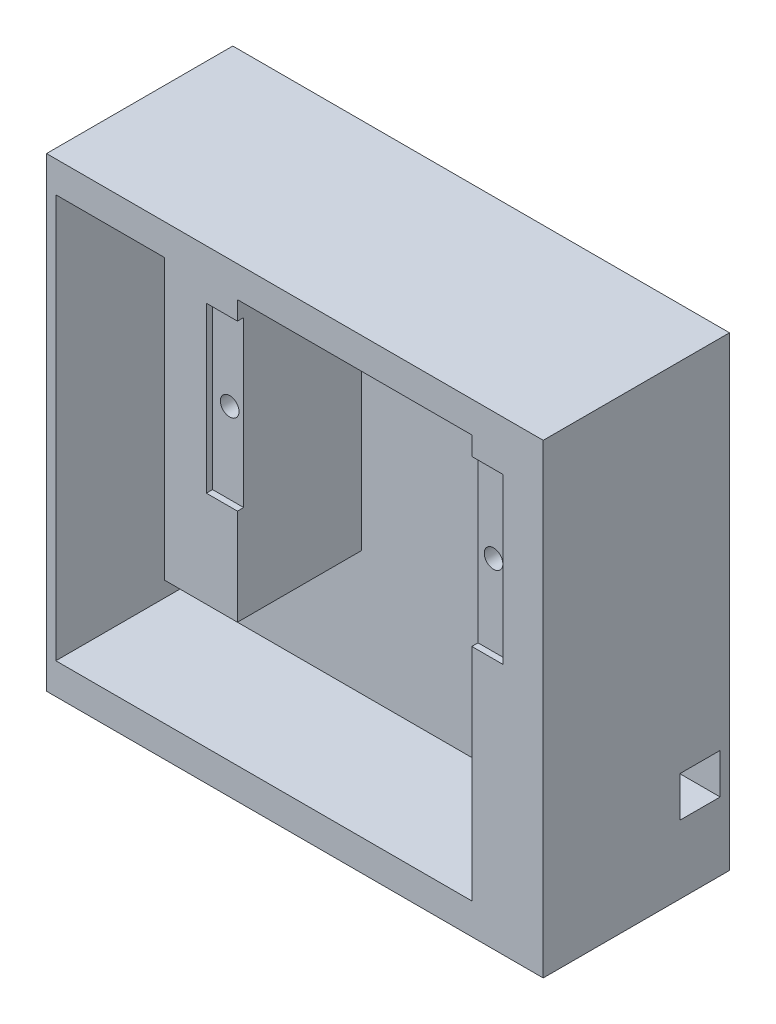
ISO-10303-21;
HEADER;
FILE_DESCRIPTION(('STEP AP214'),'2;1');
FILE_NAME('part.step','',(''),(''),'','','');
FILE_SCHEMA(('AUTOMOTIVE_DESIGN { 1 0 10303 214 1 1 1 1 }'));
ENDSEC;
DATA;
#1=APPLICATION_CONTEXT('core data for automotive mechanical design processes');
#2=APPLICATION_PROTOCOL_DEFINITION('international standard','automotive_design',2000,#1);
#3=PRODUCT_CONTEXT('',#1,'mechanical');
#4=PRODUCT('Part','Part','',(#3));
#5=PRODUCT_RELATED_PRODUCT_CATEGORY('part','',(#4));
#6=PRODUCT_DEFINITION_FORMATION('','',#4);
#7=PRODUCT_DEFINITION_CONTEXT('part definition',#1,'design');
#8=PRODUCT_DEFINITION('design','',#6,#7);
#9=PRODUCT_DEFINITION_SHAPE('','',#8);
#10=(LENGTH_UNIT() NAMED_UNIT(*) SI_UNIT(.MILLI.,.METRE.));
#11=(NAMED_UNIT(*) PLANE_ANGLE_UNIT() SI_UNIT($,.RADIAN.));
#12=(NAMED_UNIT(*) SI_UNIT($,.STERADIAN.) SOLID_ANGLE_UNIT());
#13=UNCERTAINTY_MEASURE_WITH_UNIT(LENGTH_MEASURE(1.E-05),#10,'distance_accuracy_value','');
#14=(GEOMETRIC_REPRESENTATION_CONTEXT(3) GLOBAL_UNCERTAINTY_ASSIGNED_CONTEXT((#13)) GLOBAL_UNIT_ASSIGNED_CONTEXT((#10,
#11,#12)) REPRESENTATION_CONTEXT('',''));
#15=CARTESIAN_POINT('',(0.,0.,0.));
#16=DIRECTION('',(0.,0.,1.));
#17=DIRECTION('',(1.,0.,0.));
#18=AXIS2_PLACEMENT_3D('',#15,#16,#17);
#19=CARTESIAN_POINT('',(0.,0.,60.));
#20=DIRECTION('',(-1.,0.,0.));
#21=DIRECTION('',(0.,-1.,0.));
#22=AXIS2_PLACEMENT_3D('',#19,#20,#21);
#23=PLANE('',#22);
#24=DIRECTION('',(0.,0.,-1.));
#25=VECTOR('',#24,1.);
#26=CARTESIAN_POINT('',(0.,-128.,16.));
#27=LINE('',#26,#25);
#28=CARTESIAN_POINT('',(0.,-128.,16.));
#29=VERTEX_POINT('',#28);
#30=CARTESIAN_POINT('',(0.,-128.,3.));
#31=VERTEX_POINT('',#30);
#32=EDGE_CURVE('E294',#29,#31,#27,.T.);
#33=ORIENTED_EDGE('',*,*,#32,.F.);
#34=DIRECTION('',(0.,-1.,0.));
#35=VECTOR('',#34,1.);
#36=CARTESIAN_POINT('',(0.,-115.,16.));
#37=LINE('',#36,#35);
#38=CARTESIAN_POINT('',(0.,-115.,16.));
#39=VERTEX_POINT('',#38);
#40=EDGE_CURVE('E292',#39,#29,#37,.T.);
#41=ORIENTED_EDGE('',*,*,#40,.F.);
#42=DIRECTION('',(0.,0.,1.));
#43=VECTOR('',#42,1.);
#44=CARTESIAN_POINT('',(0.,-115.,16.));
#45=LINE('',#44,#43);
#46=CARTESIAN_POINT('',(0.,-115.,3.00000000000001));
#47=VERTEX_POINT('',#46);
#48=EDGE_CURVE('E300',#47,#39,#45,.T.);
#49=ORIENTED_EDGE('',*,*,#48,.F.);
#50=DIRECTION('',(0.,1.,0.));
#51=VECTOR('',#50,1.);
#52=CARTESIAN_POINT('',(0.,-115.,3.00000000000001));
#53=LINE('',#52,#51);
#54=EDGE_CURVE('E297',#31,#47,#53,.T.);
#55=ORIENTED_EDGE('',*,*,#54,.F.);
#56=EDGE_LOOP('',(#33,#41,#49,#55));
#57=FACE_BOUND('',#56,.T.);
#58=DIRECTION('',(0.,1.,0.));
#59=VECTOR('',#58,1.);
#60=CARTESIAN_POINT('',(0.,0.,0.));
#61=LINE('',#60,#59);
#62=CARTESIAN_POINT('',(0.,-150.,0.));
#63=VERTEX_POINT('',#62);
#64=CARTESIAN_POINT('',(0.,0.,0.));
#65=VERTEX_POINT('',#64);
#66=EDGE_CURVE('E353',#63,#65,#61,.T.);
#67=ORIENTED_EDGE('',*,*,#66,.T.);
#68=DIRECTION('',(0.,0.,-1.));
#69=VECTOR('',#68,1.);
#70=CARTESIAN_POINT('',(0.,0.,60.));
#71=LINE('',#70,#69);
#72=CARTESIAN_POINT('',(0.,0.,60.));
#73=VERTEX_POINT('',#72);
#74=EDGE_CURVE('E11',#73,#65,#71,.T.);
#75=ORIENTED_EDGE('',*,*,#74,.F.);
#76=DIRECTION('',(0.,1.,0.));
#77=VECTOR('',#76,1.);
#78=CARTESIAN_POINT('',(0.,0.,60.));
#79=LINE('',#78,#77);
#80=CARTESIAN_POINT('',(0.,-150.,60.));
#81=VERTEX_POINT('',#80);
#82=EDGE_CURVE('E364',#81,#73,#79,.T.);
#83=ORIENTED_EDGE('',*,*,#82,.F.);
#84=DIRECTION('',(0.,0.,-1.));
#85=VECTOR('',#84,1.);
#86=CARTESIAN_POINT('',(0.,-150.,60.));
#87=LINE('',#86,#85);
#88=EDGE_CURVE('E374',#81,#63,#87,.T.);
#89=ORIENTED_EDGE('',*,*,#88,.T.);
#90=EDGE_LOOP('',(#67,#75,#83,#89));
#91=FACE_BOUND('',#90,.T.);
#92=ADVANCED_FACE('F35',(#57,#91),#23,.F.);
#93=CARTESIAN_POINT('',(0.,0.,60.));
#94=DIRECTION('',(0.,-1.,0.));
#95=DIRECTION('',(1.,0.,0.));
#96=AXIS2_PLACEMENT_3D('',#93,#94,#95);
#97=PLANE('',#96);
#98=DIRECTION('',(-1.,0.,0.));
#99=VECTOR('',#98,1.);
#100=CARTESIAN_POINT('',(0.,0.,0.));
#101=LINE('',#100,#99);
#102=CARTESIAN_POINT('',(-160.,0.,0.));
#103=VERTEX_POINT('',#102);
#104=EDGE_CURVE('E377',#65,#103,#101,.T.);
#105=ORIENTED_EDGE('',*,*,#104,.T.);
#106=DIRECTION('',(0.,0.,-1.));
#107=VECTOR('',#106,1.);
#108=CARTESIAN_POINT('',(-160.,0.,60.));
#109=LINE('',#108,#107);
#110=CARTESIAN_POINT('',(-160.,0.,60.));
#111=VERTEX_POINT('',#110);
#112=EDGE_CURVE('E43',#111,#103,#109,.T.);
#113=ORIENTED_EDGE('',*,*,#112,.F.);
#114=DIRECTION('',(-1.,0.,0.));
#115=VECTOR('',#114,1.);
#116=CARTESIAN_POINT('',(0.,0.,60.));
#117=LINE('',#116,#115);
#118=EDGE_CURVE('E367',#73,#111,#117,.T.);
#119=ORIENTED_EDGE('',*,*,#118,.F.);
#120=ORIENTED_EDGE('',*,*,#74,.T.);
#121=EDGE_LOOP('',(#105,#113,#119,#120));
#122=FACE_BOUND('',#121,.T.);
#123=ADVANCED_FACE('F412',(#122),#97,.F.);
#124=CARTESIAN_POINT('',(-160.,0.,60.));
#125=DIRECTION('',(1.,0.,0.));
#126=DIRECTION('',(0.,1.,0.));
#127=AXIS2_PLACEMENT_3D('',#124,#125,#126);
#128=PLANE('',#127);
#129=DIRECTION('',(0.,-1.,0.));
#130=VECTOR('',#129,1.);
#131=CARTESIAN_POINT('',(-160.,0.,0.));
#132=LINE('',#131,#130);
#133=CARTESIAN_POINT('',(-160.,-150.,0.));
#134=VERTEX_POINT('',#133);
#135=EDGE_CURVE('E379',#103,#134,#132,.T.);
#136=ORIENTED_EDGE('',*,*,#135,.T.);
#137=DIRECTION('',(0.,0.,-1.));
#138=VECTOR('',#137,1.);
#139=CARTESIAN_POINT('',(-160.,-150.,60.));
#140=LINE('',#139,#138);
#141=CARTESIAN_POINT('',(-160.,-150.,60.));
#142=VERTEX_POINT('',#141);
#143=EDGE_CURVE('E384',#142,#134,#140,.T.);
#144=ORIENTED_EDGE('',*,*,#143,.F.);
#145=DIRECTION('',(0.,-1.,0.));
#146=VECTOR('',#145,1.);
#147=CARTESIAN_POINT('',(-160.,0.,60.));
#148=LINE('',#147,#146);
#149=EDGE_CURVE('E370',#111,#142,#148,.T.);
#150=ORIENTED_EDGE('',*,*,#149,.F.);
#151=ORIENTED_EDGE('',*,*,#112,.T.);
#152=EDGE_LOOP('',(#136,#144,#150,#151));
#153=FACE_BOUND('',#152,.T.);
#154=ADVANCED_FACE('F417',(#153),#128,.F.);
#155=CARTESIAN_POINT('',(0.,-150.,60.));
#156=DIRECTION('',(0.,1.,0.));
#157=DIRECTION('',(-1.,0.,0.));
#158=AXIS2_PLACEMENT_3D('',#155,#156,#157);
#159=PLANE('',#158);
#160=DIRECTION('',(1.,0.,0.));
#161=VECTOR('',#160,1.);
#162=CARTESIAN_POINT('',(0.,-150.,0.));
#163=LINE('',#162,#161);
#164=EDGE_CURVE('E368',#134,#63,#163,.T.);
#165=ORIENTED_EDGE('',*,*,#164,.T.);
#166=ORIENTED_EDGE('',*,*,#88,.F.);
#167=DIRECTION('',(1.,0.,0.));
#168=VECTOR('',#167,1.);
#169=CARTESIAN_POINT('',(0.,-150.,60.));
#170=LINE('',#169,#168);
#171=EDGE_CURVE('E372',#142,#81,#170,.T.);
#172=ORIENTED_EDGE('',*,*,#171,.F.);
#173=ORIENTED_EDGE('',*,*,#143,.T.);
#174=EDGE_LOOP('',(#165,#166,#172,#173));
#175=FACE_BOUND('',#174,.T.);
#176=ADVANCED_FACE('F438',(#175),#159,.F.);
#177=CARTESIAN_POINT('',(0.,0.,60.));
#178=DIRECTION('',(0.,0.,-1.));
#179=DIRECTION('',(-1.,0.,0.));
#180=AXIS2_PLACEMENT_3D('',#177,#178,#179);
#181=PLANE('',#180);
#182=DIRECTION('',(0.,-1.,0.));
#183=VECTOR('',#182,1.);
#184=CARTESIAN_POINT('',(-157.,-100.,60.));
#185=LINE('',#184,#183);
#186=CARTESIAN_POINT('',(-157.,-10.,60.));
#187=VERTEX_POINT('',#186);
#188=CARTESIAN_POINT('',(-157.,-140.,60.));
#189=VERTEX_POINT('',#188);
#190=EDGE_CURVE('E340',#187,#189,#185,.T.);
#191=ORIENTED_EDGE('',*,*,#190,.F.);
#192=DIRECTION('',(-1.,0.,0.));
#193=VECTOR('',#192,1.);
#194=CARTESIAN_POINT('',(-157.,-10.,60.));
#195=LINE('',#194,#193);
#196=CARTESIAN_POINT('',(-122.,-10.,60.));
#197=VERTEX_POINT('',#196);
#198=EDGE_CURVE('E211',#197,#187,#195,.T.);
#199=ORIENTED_EDGE('',*,*,#198,.F.);
#200=DIRECTION('',(0.,1.,0.));
#201=VECTOR('',#200,1.);
#202=CARTESIAN_POINT('',(-122.,-10.,60.));
#203=LINE('',#202,#201);
#204=CARTESIAN_POINT('',(-122.,-100.,60.));
#205=VERTEX_POINT('',#204);
#206=EDGE_CURVE('E217',#205,#197,#203,.T.);
#207=ORIENTED_EDGE('',*,*,#206,.F.);
#208=DIRECTION('',(-1.,0.,0.));
#209=VECTOR('',#208,1.);
#210=CARTESIAN_POINT('',(-157.,-100.,60.));
#211=LINE('',#210,#209);
#212=CARTESIAN_POINT('',(-98.5,-100.,60.));
#213=VERTEX_POINT('',#212);
#214=EDGE_CURVE('E337',#213,#205,#211,.T.);
#215=ORIENTED_EDGE('',*,*,#214,.F.);
#216=DIRECTION('',(0.,-1.,0.));
#217=VECTOR('',#216,1.);
#218=CARTESIAN_POINT('',(-98.5,-10.,60.));
#219=LINE('',#218,#217);
#220=CARTESIAN_POINT('',(-98.5,-69.,60.));
#221=VERTEX_POINT('',#220);
#222=EDGE_CURVE('E316',#221,#213,#219,.T.);
#223=ORIENTED_EDGE('',*,*,#222,.F.);
#224=DIRECTION('',(1.,0.,0.));
#225=VECTOR('',#224,1.);
#226=CARTESIAN_POINT('',(-108.5,-69.,60.));
#227=LINE('',#226,#225);
#228=CARTESIAN_POINT('',(-108.5,-69.,60.));
#229=VERTEX_POINT('',#228);
#230=EDGE_CURVE('E247',#229,#221,#227,.T.);
#231=ORIENTED_EDGE('',*,*,#230,.F.);
#232=DIRECTION('',(0.,-1.,0.));
#233=VECTOR('',#232,1.);
#234=CARTESIAN_POINT('',(-108.5,-16.,60.));
#235=LINE('',#234,#233);
#236=CARTESIAN_POINT('',(-108.5,-16.,60.));
#237=VERTEX_POINT('',#236);
#238=EDGE_CURVE('E244',#237,#229,#235,.T.);
#239=ORIENTED_EDGE('',*,*,#238,.F.);
#240=DIRECTION('',(-1.,0.,0.));
#241=VECTOR('',#240,1.);
#242=CARTESIAN_POINT('',(-108.5,-16.,60.));
#243=LINE('',#242,#241);
#244=CARTESIAN_POINT('',(-98.5,-16.,60.));
#245=VERTEX_POINT('',#244);
#246=EDGE_CURVE('E236',#245,#237,#243,.T.);
#247=ORIENTED_EDGE('',*,*,#246,.F.);
#248=CARTESIAN_POINT('',(-98.5,-10.,60.));
#249=VERTEX_POINT('',#248);
#250=EDGE_CURVE('E334',#249,#245,#219,.T.);
#251=ORIENTED_EDGE('',*,*,#250,.F.);
#252=DIRECTION('',(-1.,0.,0.));
#253=VECTOR('',#252,1.);
#254=CARTESIAN_POINT('',(-98.5,-10.,60.));
#255=LINE('',#254,#253);
#256=CARTESIAN_POINT('',(-23.,-10.,60.));
#257=VERTEX_POINT('',#256);
#258=EDGE_CURVE('E321',#257,#249,#255,.T.);
#259=ORIENTED_EDGE('',*,*,#258,.F.);
#260=DIRECTION('',(0.,1.,0.));
#261=VECTOR('',#260,1.);
#262=CARTESIAN_POINT('',(-23.,-10.,60.));
#263=LINE('',#262,#261);
#264=CARTESIAN_POINT('',(-23.,-16.,60.));
#265=VERTEX_POINT('',#264);
#266=EDGE_CURVE('E345',#265,#257,#263,.T.);
#267=ORIENTED_EDGE('',*,*,#266,.F.);
#268=DIRECTION('',(-1.,0.,0.));
#269=VECTOR('',#268,1.);
#270=CARTESIAN_POINT('',(-23.,-16.,60.));
#271=LINE('',#270,#269);
#272=CARTESIAN_POINT('',(-13.,-16.,60.));
#273=VERTEX_POINT('',#272);
#274=EDGE_CURVE('E264',#273,#265,#271,.T.);
#275=ORIENTED_EDGE('',*,*,#274,.F.);
#276=DIRECTION('',(0.,1.,0.));
#277=VECTOR('',#276,1.);
#278=CARTESIAN_POINT('',(-13.,-16.,60.));
#279=LINE('',#278,#277);
#280=CARTESIAN_POINT('',(-13.,-69.,60.));
#281=VERTEX_POINT('',#280);
#282=EDGE_CURVE('E273',#281,#273,#279,.T.);
#283=ORIENTED_EDGE('',*,*,#282,.F.);
#284=DIRECTION('',(1.,0.,0.));
#285=VECTOR('',#284,1.);
#286=CARTESIAN_POINT('',(-23.,-69.,60.));
#287=LINE('',#286,#285);
#288=CARTESIAN_POINT('',(-23.,-69.,60.));
#289=VERTEX_POINT('',#288);
#290=EDGE_CURVE('E233',#289,#281,#287,.T.);
#291=ORIENTED_EDGE('',*,*,#290,.F.);
#292=CARTESIAN_POINT('',(-23.,-140.,60.));
#293=VERTEX_POINT('',#292);
#294=EDGE_CURVE('E346',#293,#289,#263,.T.);
#295=ORIENTED_EDGE('',*,*,#294,.F.);
#296=DIRECTION('',(1.,0.,0.));
#297=VECTOR('',#296,1.);
#298=CARTESIAN_POINT('',(-157.,-140.,60.));
#299=LINE('',#298,#297);
#300=EDGE_CURVE('E343',#189,#293,#299,.T.);
#301=ORIENTED_EDGE('',*,*,#300,.F.);
#302=EDGE_LOOP('',(#191,#199,#207,#215,#223,#231,#239,#247,#251,#259,#267,#275,#283,#291,#295,#301));
#303=FACE_BOUND('',#302,.T.);
#304=ORIENTED_EDGE('',*,*,#82,.T.);
#305=ORIENTED_EDGE('',*,*,#118,.T.);
#306=ORIENTED_EDGE('',*,*,#149,.T.);
#307=ORIENTED_EDGE('',*,*,#171,.T.);
#308=EDGE_LOOP('',(#304,#305,#306,#307));
#309=FACE_BOUND('',#308,.T.);
#310=ADVANCED_FACE('F434',(#303,#309),#181,.F.);
#311=CARTESIAN_POINT('',(0.,0.,0.));
#312=DIRECTION('',(0.,0.,-1.));
#313=DIRECTION('',(-1.,0.,0.));
#314=AXIS2_PLACEMENT_3D('',#311,#312,#313);
#315=PLANE('',#314);
#316=ORIENTED_EDGE('',*,*,#66,.F.);
#317=ORIENTED_EDGE('',*,*,#164,.F.);
#318=ORIENTED_EDGE('',*,*,#135,.F.);
#319=ORIENTED_EDGE('',*,*,#104,.F.);
#320=EDGE_LOOP('',(#316,#317,#318,#319));
#321=FACE_BOUND('',#320,.T.);
#322=ADVANCED_FACE('F429',(#321),#315,.T.);
#323=CARTESIAN_POINT('',(-98.5,-10.,20.));
#324=DIRECTION('',(-1.,0.,0.));
#325=DIRECTION('',(0.,-1.,0.));
#326=AXIS2_PLACEMENT_3D('',#323,#324,#325);
#327=PLANE('',#326);
#328=ORIENTED_EDGE('',*,*,#250,.T.);
#329=DIRECTION('',(0.,0.,1.));
#330=VECTOR('',#329,1.);
#331=CARTESIAN_POINT('',(-98.5,-16.,58.));
#332=LINE('',#331,#330);
#333=CARTESIAN_POINT('',(-98.5,-16.,58.));
#334=VERTEX_POINT('',#333);
#335=EDGE_CURVE('E255',#334,#245,#332,.T.);
#336=ORIENTED_EDGE('',*,*,#335,.F.);
#337=DIRECTION('',(0.,1.,0.));
#338=VECTOR('',#337,1.);
#339=CARTESIAN_POINT('',(-98.5,-16.,58.));
#340=LINE('',#339,#338);
#341=CARTESIAN_POINT('',(-98.5,-69.,58.));
#342=VERTEX_POINT('',#341);
#343=EDGE_CURVE('E238',#342,#334,#340,.T.);
#344=ORIENTED_EDGE('',*,*,#343,.F.);
#345=DIRECTION('',(0.,0.,1.));
#346=VECTOR('',#345,1.);
#347=CARTESIAN_POINT('',(-98.5,-69.,58.));
#348=LINE('',#347,#346);
#349=EDGE_CURVE('E257',#342,#221,#348,.T.);
#350=ORIENTED_EDGE('',*,*,#349,.T.);
#351=ORIENTED_EDGE('',*,*,#222,.T.);
#352=DIRECTION('',(0.,0.,1.));
#353=VECTOR('',#352,1.);
#354=CARTESIAN_POINT('',(-98.5,-100.,20.));
#355=LINE('',#354,#353);
#356=CARTESIAN_POINT('',(-98.5,-100.,20.));
#357=VERTEX_POINT('',#356);
#358=EDGE_CURVE('E333',#357,#213,#355,.T.);
#359=ORIENTED_EDGE('',*,*,#358,.F.);
#360=DIRECTION('',(0.,-1.,0.));
#361=VECTOR('',#360,1.);
#362=CARTESIAN_POINT('',(-98.5,-10.,20.));
#363=LINE('',#362,#361);
#364=CARTESIAN_POINT('',(-98.5,-10.,20.));
#365=VERTEX_POINT('',#364);
#366=EDGE_CURVE('E319',#365,#357,#363,.T.);
#367=ORIENTED_EDGE('',*,*,#366,.F.);
#368=DIRECTION('',(0.,0.,1.));
#369=VECTOR('',#368,1.);
#370=CARTESIAN_POINT('',(-98.5,-10.,20.));
#371=LINE('',#370,#369);
#372=EDGE_CURVE('E351',#365,#249,#371,.T.);
#373=ORIENTED_EDGE('',*,*,#372,.T.);
#374=EDGE_LOOP('',(#328,#336,#344,#350,#351,#359,#367,#373));
#375=FACE_BOUND('',#374,.T.);
#376=ADVANCED_FACE('F449',(#375),#327,.F.);
#377=CARTESIAN_POINT('',(-98.5,-10.,20.));
#378=DIRECTION('',(0.,1.,0.));
#379=DIRECTION('',(0.,0.,1.));
#380=AXIS2_PLACEMENT_3D('',#377,#378,#379);
#381=PLANE('',#380);
#382=ORIENTED_EDGE('',*,*,#258,.T.);
#383=ORIENTED_EDGE('',*,*,#372,.F.);
#384=DIRECTION('',(-1.,0.,0.));
#385=VECTOR('',#384,1.);
#386=CARTESIAN_POINT('',(-98.5,-10.,20.));
#387=LINE('',#386,#385);
#388=CARTESIAN_POINT('',(-23.,-10.,20.));
#389=VERTEX_POINT('',#388);
#390=EDGE_CURVE('E330',#389,#365,#387,.T.);
#391=ORIENTED_EDGE('',*,*,#390,.F.);
#392=DIRECTION('',(0.,0.,1.));
#393=VECTOR('',#392,1.);
#394=CARTESIAN_POINT('',(-23.,-10.,20.));
#395=LINE('',#394,#393);
#396=EDGE_CURVE('E354',#389,#257,#395,.T.);
#397=ORIENTED_EDGE('',*,*,#396,.T.);
#398=EDGE_LOOP('',(#382,#383,#391,#397));
#399=FACE_BOUND('',#398,.T.);
#400=ADVANCED_FACE('F455',(#399),#381,.F.);
#401=CARTESIAN_POINT('',(-23.,-10.,20.));
#402=DIRECTION('',(1.,0.,0.));
#403=DIRECTION('',(0.,1.,0.));
#404=AXIS2_PLACEMENT_3D('',#401,#402,#403);
#405=PLANE('',#404);
#406=DIRECTION('',(0.,-1.,0.));
#407=VECTOR('',#406,1.);
#408=CARTESIAN_POINT('',(-23.,-16.,58.));
#409=LINE('',#408,#407);
#410=CARTESIAN_POINT('',(-23.,-16.,58.));
#411=VERTEX_POINT('',#410);
#412=CARTESIAN_POINT('',(-23.,-69.,58.));
#413=VERTEX_POINT('',#412);
#414=EDGE_CURVE('E261',#411,#413,#409,.T.);
#415=ORIENTED_EDGE('',*,*,#414,.F.);
#416=DIRECTION('',(0.,0.,1.));
#417=VECTOR('',#416,1.);
#418=CARTESIAN_POINT('',(-23.,-16.,58.));
#419=LINE('',#418,#417);
#420=EDGE_CURVE('E248',#411,#265,#419,.T.);
#421=ORIENTED_EDGE('',*,*,#420,.T.);
#422=ORIENTED_EDGE('',*,*,#266,.T.);
#423=ORIENTED_EDGE('',*,*,#396,.F.);
#424=DIRECTION('',(0.,1.,0.));
#425=VECTOR('',#424,1.);
#426=CARTESIAN_POINT('',(-23.,-10.,20.));
#427=LINE('',#426,#425);
#428=CARTESIAN_POINT('',(-23.,-140.,20.));
#429=VERTEX_POINT('',#428);
#430=EDGE_CURVE('E327',#429,#389,#427,.T.);
#431=ORIENTED_EDGE('',*,*,#430,.F.);
#432=DIRECTION('',(0.,0.,1.));
#433=VECTOR('',#432,1.);
#434=CARTESIAN_POINT('',(-23.,-140.,20.));
#435=LINE('',#434,#433);
#436=EDGE_CURVE('E357',#429,#293,#435,.T.);
#437=ORIENTED_EDGE('',*,*,#436,.T.);
#438=ORIENTED_EDGE('',*,*,#294,.T.);
#439=DIRECTION('',(0.,0.,1.));
#440=VECTOR('',#439,1.);
#441=CARTESIAN_POINT('',(-23.,-69.,58.));
#442=LINE('',#441,#440);
#443=EDGE_CURVE('E270',#413,#289,#442,.T.);
#444=ORIENTED_EDGE('',*,*,#443,.F.);
#445=EDGE_LOOP('',(#415,#421,#422,#423,#431,#437,#438,#444));
#446=FACE_BOUND('',#445,.T.);
#447=ADVANCED_FACE('F468',(#446),#405,.F.);
#448=CARTESIAN_POINT('',(-157.,-140.,20.));
#449=DIRECTION('',(0.,-1.,0.));
#450=DIRECTION('',(0.,0.,-1.));
#451=AXIS2_PLACEMENT_3D('',#448,#449,#450);
#452=PLANE('',#451);
#453=ORIENTED_EDGE('',*,*,#436,.F.);
#454=DIRECTION('',(1.,0.,0.));
#455=VECTOR('',#454,1.);
#456=CARTESIAN_POINT('',(-157.,-140.,20.));
#457=LINE('',#456,#455);
#458=CARTESIAN_POINT('',(-157.,-140.,20.));
#459=VERTEX_POINT('',#458);
#460=EDGE_CURVE('E325',#459,#429,#457,.T.);
#461=ORIENTED_EDGE('',*,*,#460,.F.);
#462=DIRECTION('',(0.,0.,1.));
#463=VECTOR('',#462,1.);
#464=CARTESIAN_POINT('',(-157.,-140.,20.));
#465=LINE('',#464,#463);
#466=EDGE_CURVE('E360',#459,#189,#465,.T.);
#467=ORIENTED_EDGE('',*,*,#466,.T.);
#468=ORIENTED_EDGE('',*,*,#300,.T.);
#469=EDGE_LOOP('',(#453,#461,#467,#468));
#470=FACE_BOUND('',#469,.T.);
#471=ADVANCED_FACE('F464',(#470),#452,.F.);
#472=CARTESIAN_POINT('',(-157.,-100.,20.));
#473=DIRECTION('',(-1.,0.,0.));
#474=DIRECTION('',(0.,0.,1.));
#475=AXIS2_PLACEMENT_3D('',#472,#473,#474);
#476=PLANE('',#475);
#477=ORIENTED_EDGE('',*,*,#190,.T.);
#478=ORIENTED_EDGE('',*,*,#466,.F.);
#479=DIRECTION('',(0.,-1.,0.));
#480=VECTOR('',#479,1.);
#481=CARTESIAN_POINT('',(-157.,-100.,20.));
#482=LINE('',#481,#480);
#483=CARTESIAN_POINT('',(-157.,-10.,20.));
#484=VERTEX_POINT('',#483);
#485=EDGE_CURVE('E323',#484,#459,#482,.T.);
#486=ORIENTED_EDGE('',*,*,#485,.F.);
#487=DIRECTION('',(0.,0.,1.));
#488=VECTOR('',#487,1.);
#489=CARTESIAN_POINT('',(-157.,-10.,20.));
#490=LINE('',#489,#488);
#491=EDGE_CURVE('E221',#484,#187,#490,.T.);
#492=ORIENTED_EDGE('',*,*,#491,.T.);
#493=EDGE_LOOP('',(#477,#478,#486,#492));
#494=FACE_BOUND('',#493,.T.);
#495=ADVANCED_FACE('F460',(#494),#476,.F.);
#496=CARTESIAN_POINT('',(-157.,-100.,20.));
#497=DIRECTION('',(0.,1.,0.));
#498=DIRECTION('',(0.,0.,1.));
#499=AXIS2_PLACEMENT_3D('',#496,#497,#498);
#500=PLANE('',#499);
#501=ORIENTED_EDGE('',*,*,#214,.T.);
#502=DIRECTION('',(0.,0.,-1.));
#503=VECTOR('',#502,1.);
#504=CARTESIAN_POINT('',(-122.,-100.,20.));
#505=LINE('',#504,#503);
#506=CARTESIAN_POINT('',(-122.,-100.,20.));
#507=VERTEX_POINT('',#506);
#508=EDGE_CURVE('E230',#205,#507,#505,.T.);
#509=ORIENTED_EDGE('',*,*,#508,.T.);
#510=DIRECTION('',(-1.,0.,0.));
#511=VECTOR('',#510,1.);
#512=CARTESIAN_POINT('',(-157.,-100.,20.));
#513=LINE('',#512,#511);
#514=EDGE_CURVE('E208',#357,#507,#513,.T.);
#515=ORIENTED_EDGE('',*,*,#514,.F.);
#516=ORIENTED_EDGE('',*,*,#358,.T.);
#517=EDGE_LOOP('',(#501,#509,#515,#516));
#518=FACE_BOUND('',#517,.T.);
#519=ADVANCED_FACE('F457',(#518),#500,.F.);
#520=CARTESIAN_POINT('',(0.,0.,20.));
#521=DIRECTION('',(0.,0.,1.));
#522=DIRECTION('',(1.,0.,0.));
#523=AXIS2_PLACEMENT_3D('',#520,#521,#522);
#524=PLANE('',#523);
#525=ORIENTED_EDGE('',*,*,#514,.T.);
#526=DIRECTION('',(0.,1.,0.));
#527=VECTOR('',#526,1.);
#528=CARTESIAN_POINT('',(-122.,-10.,20.));
#529=LINE('',#528,#527);
#530=CARTESIAN_POINT('',(-122.,-10.,20.));
#531=VERTEX_POINT('',#530);
#532=EDGE_CURVE('E200',#507,#531,#529,.T.);
#533=ORIENTED_EDGE('',*,*,#532,.T.);
#534=DIRECTION('',(-1.,0.,0.));
#535=VECTOR('',#534,1.);
#536=CARTESIAN_POINT('',(-157.,-10.,20.));
#537=LINE('',#536,#535);
#538=EDGE_CURVE('E205',#531,#484,#537,.T.);
#539=ORIENTED_EDGE('',*,*,#538,.T.);
#540=ORIENTED_EDGE('',*,*,#485,.T.);
#541=ORIENTED_EDGE('',*,*,#460,.T.);
#542=ORIENTED_EDGE('',*,*,#430,.T.);
#543=ORIENTED_EDGE('',*,*,#390,.T.);
#544=ORIENTED_EDGE('',*,*,#366,.T.);
#545=EDGE_LOOP('',(#525,#533,#539,#540,#541,#542,#543,#544));
#546=FACE_BOUND('',#545,.T.);
#547=ADVANCED_FACE('F202',(#546),#524,.T.);
#548=CARTESIAN_POINT('',(-41.3847763108502,-115.,16.));
#549=DIRECTION('',(0.,0.,1.));
#550=DIRECTION('',(1.,0.,0.));
#551=AXIS2_PLACEMENT_3D('',#548,#549,#550);
#552=PLANE('',#551);
#553=DIRECTION('',(0.,1.,0.));
#554=VECTOR('',#553,1.);
#555=CARTESIAN_POINT('',(-23.,-115.,16.));
#556=LINE('',#555,#554);
#557=CARTESIAN_POINT('',(-23.,-128.,16.));
#558=VERTEX_POINT('',#557);
#559=CARTESIAN_POINT('',(-23.,-115.,16.));
#560=VERTEX_POINT('',#559);
#561=EDGE_CURVE('E289',#558,#560,#556,.T.);
#562=ORIENTED_EDGE('',*,*,#561,.T.);
#563=DIRECTION('',(1.,0.,0.));
#564=VECTOR('',#563,1.);
#565=CARTESIAN_POINT('',(-41.3847763108502,-115.,16.));
#566=LINE('',#565,#564);
#567=EDGE_CURVE('E287',#560,#39,#566,.T.);
#568=ORIENTED_EDGE('',*,*,#567,.T.);
#569=ORIENTED_EDGE('',*,*,#40,.T.);
#570=DIRECTION('',(1.,0.,0.));
#571=VECTOR('',#570,1.);
#572=CARTESIAN_POINT('',(-41.3847763108502,-128.,16.));
#573=LINE('',#572,#571);
#574=EDGE_CURVE('E303',#558,#29,#573,.T.);
#575=ORIENTED_EDGE('',*,*,#574,.F.);
#576=EDGE_LOOP('',(#562,#568,#569,#575));
#577=FACE_BOUND('',#576,.T.);
#578=ADVANCED_FACE('F476',(#577),#552,.F.);
#579=CARTESIAN_POINT('',(-41.3847763108502,-115.,16.));
#580=DIRECTION('',(0.,1.,0.));
#581=DIRECTION('',(-1.,0.,0.));
#582=AXIS2_PLACEMENT_3D('',#579,#580,#581);
#583=PLANE('',#582);
#584=DIRECTION('',(0.,0.,-1.));
#585=VECTOR('',#584,1.);
#586=CARTESIAN_POINT('',(-23.,-115.,16.));
#587=LINE('',#586,#585);
#588=CARTESIAN_POINT('',(-23.,-115.,3.00000000000001));
#589=VERTEX_POINT('',#588);
#590=EDGE_CURVE('E286',#560,#589,#587,.T.);
#591=ORIENTED_EDGE('',*,*,#590,.T.);
#592=DIRECTION('',(1.,0.,0.));
#593=VECTOR('',#592,1.);
#594=CARTESIAN_POINT('',(-41.3847763108502,-115.,3.00000000000001));
#595=LINE('',#594,#593);
#596=EDGE_CURVE('E305',#589,#47,#595,.T.);
#597=ORIENTED_EDGE('',*,*,#596,.T.);
#598=ORIENTED_EDGE('',*,*,#48,.T.);
#599=ORIENTED_EDGE('',*,*,#567,.F.);
#600=EDGE_LOOP('',(#591,#597,#598,#599));
#601=FACE_BOUND('',#600,.T.);
#602=ADVANCED_FACE('F480',(#601),#583,.F.);
#603=CARTESIAN_POINT('',(-41.3847763108502,-115.,3.00000000000001));
#604=DIRECTION('',(0.,0.,-1.));
#605=DIRECTION('',(0.,1.,0.));
#606=AXIS2_PLACEMENT_3D('',#603,#604,#605);
#607=PLANE('',#606);
#608=DIRECTION('',(0.,-1.,0.));
#609=VECTOR('',#608,1.);
#610=CARTESIAN_POINT('',(-23.,-115.,3.00000000000001));
#611=LINE('',#610,#609);
#612=CARTESIAN_POINT('',(-23.,-128.,3.));
#613=VERTEX_POINT('',#612);
#614=EDGE_CURVE('E284',#589,#613,#611,.T.);
#615=ORIENTED_EDGE('',*,*,#614,.T.);
#616=DIRECTION('',(1.,0.,0.));
#617=VECTOR('',#616,1.);
#618=CARTESIAN_POINT('',(-41.3847763108502,-128.,3.));
#619=LINE('',#618,#617);
#620=EDGE_CURVE('E307',#613,#31,#619,.T.);
#621=ORIENTED_EDGE('',*,*,#620,.T.);
#622=ORIENTED_EDGE('',*,*,#54,.T.);
#623=ORIENTED_EDGE('',*,*,#596,.F.);
#624=EDGE_LOOP('',(#615,#621,#622,#623));
#625=FACE_BOUND('',#624,.T.);
#626=ADVANCED_FACE('F486',(#625),#607,.F.);
#627=CARTESIAN_POINT('',(-41.3847763108502,-128.,16.));
#628=DIRECTION('',(0.,-1.,0.));
#629=DIRECTION('',(1.,0.,0.));
#630=AXIS2_PLACEMENT_3D('',#627,#628,#629);
#631=PLANE('',#630);
#632=DIRECTION('',(0.,0.,1.));
#633=VECTOR('',#632,1.);
#634=CARTESIAN_POINT('',(-23.,-128.,16.));
#635=LINE('',#634,#633);
#636=EDGE_CURVE('E291',#613,#558,#635,.T.);
#637=ORIENTED_EDGE('',*,*,#636,.T.);
#638=ORIENTED_EDGE('',*,*,#574,.T.);
#639=ORIENTED_EDGE('',*,*,#32,.T.);
#640=ORIENTED_EDGE('',*,*,#620,.F.);
#641=EDGE_LOOP('',(#637,#638,#639,#640));
#642=FACE_BOUND('',#641,.T.);
#643=ADVANCED_FACE('F491',(#642),#631,.F.);
#644=CARTESIAN_POINT('',(-23.,-10.,20.));
#645=DIRECTION('',(1.,0.,0.));
#646=DIRECTION('',(0.,1.,0.));
#647=AXIS2_PLACEMENT_3D('',#644,#645,#646);
#648=PLANE('',#647);
#649=ORIENTED_EDGE('',*,*,#561,.F.);
#650=ORIENTED_EDGE('',*,*,#636,.F.);
#651=ORIENTED_EDGE('',*,*,#614,.F.);
#652=ORIENTED_EDGE('',*,*,#590,.F.);
#653=EDGE_LOOP('',(#649,#650,#651,#652));
#654=FACE_BOUND('',#653,.T.);
#655=ADVANCED_FACE('F553',(#654),#648,.T.);
#656=CARTESIAN_POINT('',(0.,0.,58.));
#657=DIRECTION('',(0.,0.,1.));
#658=DIRECTION('',(1.,0.,0.));
#659=AXIS2_PLACEMENT_3D('',#656,#657,#658);
#660=PLANE('',#659);
#661=DIRECTION('',(0.,-1.,0.));
#662=VECTOR('',#661,1.);
#663=CARTESIAN_POINT('',(-108.5,-16.,58.));
#664=LINE('',#663,#662);
#665=CARTESIAN_POINT('',(-108.5,-16.,58.));
#666=VERTEX_POINT('',#665);
#667=CARTESIAN_POINT('',(-108.5,-69.,58.));
#668=VERTEX_POINT('',#667);
#669=EDGE_CURVE('E234',#666,#668,#664,.T.);
#670=ORIENTED_EDGE('',*,*,#669,.T.);
#671=DIRECTION('',(1.,0.,0.));
#672=VECTOR('',#671,1.);
#673=CARTESIAN_POINT('',(-108.5,-69.,58.));
#674=LINE('',#673,#672);
#675=EDGE_CURVE('E51',#668,#342,#674,.T.);
#676=ORIENTED_EDGE('',*,*,#675,.T.);
#677=ORIENTED_EDGE('',*,*,#343,.T.);
#678=DIRECTION('',(-1.,0.,0.));
#679=VECTOR('',#678,1.);
#680=CARTESIAN_POINT('',(-108.5,-16.,58.));
#681=LINE('',#680,#679);
#682=EDGE_CURVE('E240',#334,#666,#681,.T.);
#683=ORIENTED_EDGE('',*,*,#682,.T.);
#684=EDGE_LOOP('',(#670,#676,#677,#683));
#685=FACE_BOUND('',#684,.T.);
#686=CARTESIAN_POINT('',(-103.,-43.,58.));
#687=DIRECTION('',(0.,0.,1.));
#688=DIRECTION('',(1.,0.,0.));
#689=AXIS2_PLACEMENT_3D('',#686,#687,#688);
#690=CIRCLE('',#689,2.99999999999999);
#691=CARTESIAN_POINT('',(-100.,-43.,58.));
#692=VERTEX_POINT('',#691);
#693=EDGE_CURVE('E254',#692,#692,#690,.F.);
#694=ORIENTED_EDGE('',*,*,#693,.T.);
#695=EDGE_LOOP('',(#694));
#696=FACE_BOUND('',#695,.T.);
#697=ADVANCED_FACE('F562',(#685,#696),#660,.T.);
#698=CARTESIAN_POINT('',(-108.5,-16.,58.));
#699=DIRECTION('',(-1.,0.,0.));
#700=DIRECTION('',(0.,0.,1.));
#701=AXIS2_PLACEMENT_3D('',#698,#699,#700);
#702=PLANE('',#701);
#703=ORIENTED_EDGE('',*,*,#238,.T.);
#704=DIRECTION('',(0.,0.,1.));
#705=VECTOR('',#704,1.);
#706=CARTESIAN_POINT('',(-108.5,-69.,58.));
#707=LINE('',#706,#705);
#708=EDGE_CURVE('E243',#668,#229,#707,.T.);
#709=ORIENTED_EDGE('',*,*,#708,.F.);
#710=ORIENTED_EDGE('',*,*,#669,.F.);
#711=DIRECTION('',(0.,0.,1.));
#712=VECTOR('',#711,1.);
#713=CARTESIAN_POINT('',(-108.5,-16.,58.));
#714=LINE('',#713,#712);
#715=EDGE_CURVE('E252',#666,#237,#714,.T.);
#716=ORIENTED_EDGE('',*,*,#715,.T.);
#717=EDGE_LOOP('',(#703,#709,#710,#716));
#718=FACE_BOUND('',#717,.T.);
#719=ADVANCED_FACE('F586',(#718),#702,.F.);
#720=CARTESIAN_POINT('',(-108.5,-16.,58.));
#721=DIRECTION('',(0.,1.,0.));
#722=DIRECTION('',(-1.,0.,0.));
#723=AXIS2_PLACEMENT_3D('',#720,#721,#722);
#724=PLANE('',#723);
#725=ORIENTED_EDGE('',*,*,#246,.T.);
#726=ORIENTED_EDGE('',*,*,#715,.F.);
#727=ORIENTED_EDGE('',*,*,#682,.F.);
#728=ORIENTED_EDGE('',*,*,#335,.T.);
#729=EDGE_LOOP('',(#725,#726,#727,#728));
#730=FACE_BOUND('',#729,.T.);
#731=ADVANCED_FACE('F596',(#730),#724,.F.);
#732=CARTESIAN_POINT('',(-108.5,-69.,58.));
#733=DIRECTION('',(0.,-1.,0.));
#734=DIRECTION('',(0.,0.,-1.));
#735=AXIS2_PLACEMENT_3D('',#732,#733,#734);
#736=PLANE('',#735);
#737=ORIENTED_EDGE('',*,*,#230,.T.);
#738=ORIENTED_EDGE('',*,*,#349,.F.);
#739=ORIENTED_EDGE('',*,*,#675,.F.);
#740=ORIENTED_EDGE('',*,*,#708,.T.);
#741=EDGE_LOOP('',(#737,#738,#739,#740));
#742=FACE_BOUND('',#741,.T.);
#743=ADVANCED_FACE('F606',(#742),#736,.F.);
#744=CARTESIAN_POINT('',(0.,0.,58.));
#745=DIRECTION('',(0.,0.,1.));
#746=DIRECTION('',(1.,0.,0.));
#747=AXIS2_PLACEMENT_3D('',#744,#745,#746);
#748=PLANE('',#747);
#749=ORIENTED_EDGE('',*,*,#414,.T.);
#750=DIRECTION('',(1.,0.,0.));
#751=VECTOR('',#750,1.);
#752=CARTESIAN_POINT('',(-23.,-69.,58.));
#753=LINE('',#752,#751);
#754=CARTESIAN_POINT('',(-13.,-69.,58.));
#755=VERTEX_POINT('',#754);
#756=EDGE_CURVE('E263',#413,#755,#753,.T.);
#757=ORIENTED_EDGE('',*,*,#756,.T.);
#758=DIRECTION('',(0.,1.,0.));
#759=VECTOR('',#758,1.);
#760=CARTESIAN_POINT('',(-13.,-16.,58.));
#761=LINE('',#760,#759);
#762=CARTESIAN_POINT('',(-13.,-16.,58.));
#763=VERTEX_POINT('',#762);
#764=EDGE_CURVE('E267',#755,#763,#761,.T.);
#765=ORIENTED_EDGE('',*,*,#764,.T.);
#766=DIRECTION('',(-1.,0.,0.));
#767=VECTOR('',#766,1.);
#768=CARTESIAN_POINT('',(-23.,-16.,58.));
#769=LINE('',#768,#767);
#770=EDGE_CURVE('E59',#763,#411,#769,.T.);
#771=ORIENTED_EDGE('',*,*,#770,.T.);
#772=EDGE_LOOP('',(#749,#757,#765,#771));
#773=FACE_BOUND('',#772,.T.);
#774=CARTESIAN_POINT('',(-18.,-43.,58.));
#775=DIRECTION('',(0.,0.,1.));
#776=DIRECTION('',(1.,0.,0.));
#777=AXIS2_PLACEMENT_3D('',#774,#775,#776);
#778=CIRCLE('',#777,3.);
#779=CARTESIAN_POINT('',(-15.,-43.,58.));
#780=VERTEX_POINT('',#779);
#781=EDGE_CURVE('E38',#780,#780,#778,.F.);
#782=ORIENTED_EDGE('',*,*,#781,.T.);
#783=EDGE_LOOP('',(#782));
#784=FACE_BOUND('',#783,.T.);
#785=ADVANCED_FACE('F394',(#773,#784),#748,.T.);
#786=CARTESIAN_POINT('',(-23.,-16.,58.));
#787=DIRECTION('',(0.,1.,0.));
#788=DIRECTION('',(0.,0.,1.));
#789=AXIS2_PLACEMENT_3D('',#786,#787,#788);
#790=PLANE('',#789);
#791=ORIENTED_EDGE('',*,*,#274,.T.);
#792=ORIENTED_EDGE('',*,*,#420,.F.);
#793=ORIENTED_EDGE('',*,*,#770,.F.);
#794=DIRECTION('',(0.,0.,1.));
#795=VECTOR('',#794,1.);
#796=CARTESIAN_POINT('',(-13.,-16.,58.));
#797=LINE('',#796,#795);
#798=EDGE_CURVE('E279',#763,#273,#797,.T.);
#799=ORIENTED_EDGE('',*,*,#798,.T.);
#800=EDGE_LOOP('',(#791,#792,#793,#799));
#801=FACE_BOUND('',#800,.T.);
#802=ADVANCED_FACE('F625',(#801),#790,.F.);
#803=CARTESIAN_POINT('',(-13.,-16.,58.));
#804=DIRECTION('',(1.,0.,0.));
#805=DIRECTION('',(0.,1.,0.));
#806=AXIS2_PLACEMENT_3D('',#803,#804,#805);
#807=PLANE('',#806);
#808=ORIENTED_EDGE('',*,*,#282,.T.);
#809=ORIENTED_EDGE('',*,*,#798,.F.);
#810=ORIENTED_EDGE('',*,*,#764,.F.);
#811=DIRECTION('',(0.,0.,1.));
#812=VECTOR('',#811,1.);
#813=CARTESIAN_POINT('',(-13.,-69.,58.));
#814=LINE('',#813,#812);
#815=EDGE_CURVE('E281',#755,#281,#814,.T.);
#816=ORIENTED_EDGE('',*,*,#815,.T.);
#817=EDGE_LOOP('',(#808,#809,#810,#816));
#818=FACE_BOUND('',#817,.T.);
#819=ADVANCED_FACE('F634',(#818),#807,.F.);
#820=CARTESIAN_POINT('',(-23.,-69.,58.));
#821=DIRECTION('',(0.,-1.,0.));
#822=DIRECTION('',(0.,0.,-1.));
#823=AXIS2_PLACEMENT_3D('',#820,#821,#822);
#824=PLANE('',#823);
#825=ORIENTED_EDGE('',*,*,#290,.T.);
#826=ORIENTED_EDGE('',*,*,#815,.F.);
#827=ORIENTED_EDGE('',*,*,#756,.F.);
#828=ORIENTED_EDGE('',*,*,#443,.T.);
#829=EDGE_LOOP('',(#825,#826,#827,#828));
#830=FACE_BOUND('',#829,.T.);
#831=ADVANCED_FACE('F496',(#830),#824,.F.);
#832=CARTESIAN_POINT('',(-103.,-43.,20.));
#833=DIRECTION('',(0.,0.,1.));
#834=DIRECTION('',(1.,0.,0.));
#835=AXIS2_PLACEMENT_3D('',#832,#833,#834);
#836=PLANE('',#835);
#837=CARTESIAN_POINT('',(-103.,-43.,20.));
#838=DIRECTION('',(0.,0.,1.));
#839=DIRECTION('',(1.,0.,0.));
#840=AXIS2_PLACEMENT_3D('',#837,#838,#839);
#841=CIRCLE('',#840,2.99999999999999);
#842=CARTESIAN_POINT('',(-100.,-43.,20.));
#843=VERTEX_POINT('',#842);
#844=EDGE_CURVE('E313',#843,#843,#841,.T.);
#845=ORIENTED_EDGE('',*,*,#844,.T.);
#846=EDGE_LOOP('',(#845));
#847=FACE_BOUND('',#846,.T.);
#848=ADVANCED_FACE('F493',(#847),#836,.T.);
#849=CARTESIAN_POINT('',(-103.,-43.,20.));
#850=DIRECTION('',(0.,0.,1.));
#851=DIRECTION('',(1.,0.,0.));
#852=AXIS2_PLACEMENT_3D('',#849,#850,#851);
#853=CYLINDRICAL_SURFACE('',#852,2.99999999999999);
#854=ORIENTED_EDGE('',*,*,#844,.F.);
#855=EDGE_LOOP('',(#854));
#856=FACE_BOUND('',#855,.T.);
#857=ORIENTED_EDGE('',*,*,#693,.F.);
#858=EDGE_LOOP('',(#857));
#859=FACE_BOUND('',#858,.T.);
#860=ADVANCED_FACE('F406',(#856,#859),#853,.F.);
#861=CARTESIAN_POINT('',(-18.,-43.,20.));
#862=DIRECTION('',(0.,0.,1.));
#863=DIRECTION('',(1.,0.,0.));
#864=AXIS2_PLACEMENT_3D('',#861,#862,#863);
#865=PLANE('',#864);
#866=CARTESIAN_POINT('',(-18.,-43.,20.));
#867=DIRECTION('',(0.,0.,1.));
#868=DIRECTION('',(1.,0.,0.));
#869=AXIS2_PLACEMENT_3D('',#866,#867,#868);
#870=CIRCLE('',#869,3.);
#871=CARTESIAN_POINT('',(-15.,-43.,20.));
#872=VERTEX_POINT('',#871);
#873=EDGE_CURVE('E312',#872,#872,#870,.T.);
#874=ORIENTED_EDGE('',*,*,#873,.T.);
#875=EDGE_LOOP('',(#874));
#876=FACE_BOUND('',#875,.T.);
#877=ADVANCED_FACE('F398',(#876),#865,.T.);
#878=CARTESIAN_POINT('',(-18.,-43.,20.));
#879=DIRECTION('',(0.,0.,1.));
#880=DIRECTION('',(1.,0.,0.));
#881=AXIS2_PLACEMENT_3D('',#878,#879,#880);
#882=CYLINDRICAL_SURFACE('',#881,3.);
#883=ORIENTED_EDGE('',*,*,#873,.F.);
#884=EDGE_LOOP('',(#883));
#885=FACE_BOUND('',#884,.T.);
#886=ORIENTED_EDGE('',*,*,#781,.F.);
#887=EDGE_LOOP('',(#886));
#888=FACE_BOUND('',#887,.T.);
#889=ADVANCED_FACE('F396',(#885,#888),#882,.F.);
#890=CARTESIAN_POINT('',(-122.,-10.,20.));
#891=DIRECTION('',(1.,0.,0.));
#892=DIRECTION('',(0.,1.,0.));
#893=AXIS2_PLACEMENT_3D('',#890,#891,#892);
#894=PLANE('',#893);
#895=ORIENTED_EDGE('',*,*,#206,.T.);
#896=DIRECTION('',(0.,0.,1.));
#897=VECTOR('',#896,1.);
#898=CARTESIAN_POINT('',(-122.,-10.,20.));
#899=LINE('',#898,#897);
#900=EDGE_CURVE('E214',#531,#197,#899,.T.);
#901=ORIENTED_EDGE('',*,*,#900,.F.);
#902=ORIENTED_EDGE('',*,*,#532,.F.);
#903=ORIENTED_EDGE('',*,*,#508,.F.);
#904=EDGE_LOOP('',(#895,#901,#902,#903));
#905=FACE_BOUND('',#904,.T.);
#906=ADVANCED_FACE('F215',(#905),#894,.F.);
#907=CARTESIAN_POINT('',(-157.,-10.,20.));
#908=DIRECTION('',(0.,1.,0.));
#909=DIRECTION('',(0.,0.,1.));
#910=AXIS2_PLACEMENT_3D('',#907,#908,#909);
#911=PLANE('',#910);
#912=ORIENTED_EDGE('',*,*,#198,.T.);
#913=ORIENTED_EDGE('',*,*,#491,.F.);
#914=ORIENTED_EDGE('',*,*,#538,.F.);
#915=ORIENTED_EDGE('',*,*,#900,.T.);
#916=EDGE_LOOP('',(#912,#913,#914,#915));
#917=FACE_BOUND('',#916,.T.);
#918=ADVANCED_FACE('F224',(#917),#911,.F.);
#919=CLOSED_SHELL('',(#92,#123,#154,#176,#310,#322,#376,#400,#447,#471,#495,#519,#547,#578,#602,
#626,#643,#655,#697,#719,#731,#743,#785,#802,#819,#831,#848,#860,#877,#889,#906,#918));
#920=MANIFOLD_SOLID_BREP('B2',#919);
#921=ADVANCED_BREP_SHAPE_REPRESENTATION('',(#18,#920),#14);
#922=SHAPE_DEFINITION_REPRESENTATION(#9,#921);
ENDSEC;
END-ISO-10303-21;
